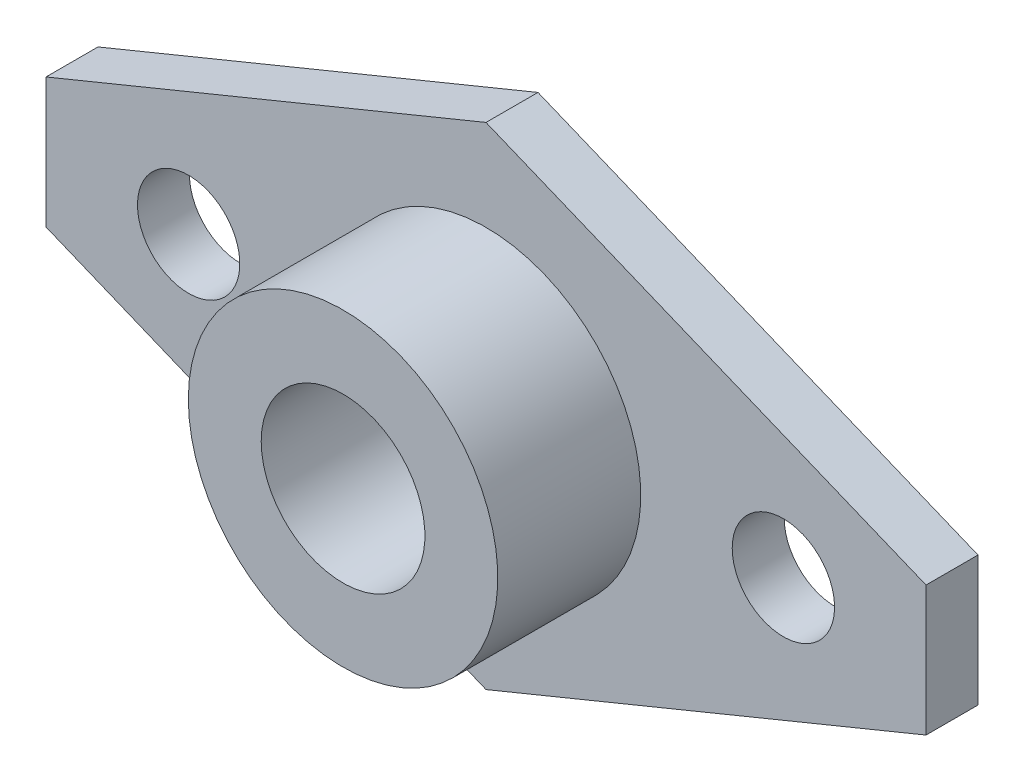
ISO-10303-21;
HEADER;
FILE_DESCRIPTION(('STEP AP214'),'2;1');
FILE_NAME('part.step','',(''),(''),'','','');
FILE_SCHEMA(('AUTOMOTIVE_DESIGN { 1 0 10303 214 1 1 1 1 }'));
ENDSEC;
DATA;
#1=APPLICATION_CONTEXT('core data for automotive mechanical design processes');
#2=APPLICATION_PROTOCOL_DEFINITION('international standard','automotive_design',2000,#1);
#3=PRODUCT_CONTEXT('',#1,'mechanical');
#4=PRODUCT('Part','Part','',(#3));
#5=PRODUCT_RELATED_PRODUCT_CATEGORY('part','',(#4));
#6=PRODUCT_DEFINITION_FORMATION('','',#4);
#7=PRODUCT_DEFINITION_CONTEXT('part definition',#1,'design');
#8=PRODUCT_DEFINITION('design','',#6,#7);
#9=PRODUCT_DEFINITION_SHAPE('','',#8);
#10=(LENGTH_UNIT() NAMED_UNIT(*) SI_UNIT(.MILLI.,.METRE.));
#11=(NAMED_UNIT(*) PLANE_ANGLE_UNIT() SI_UNIT($,.RADIAN.));
#12=(NAMED_UNIT(*) SI_UNIT($,.STERADIAN.) SOLID_ANGLE_UNIT());
#13=UNCERTAINTY_MEASURE_WITH_UNIT(LENGTH_MEASURE(1.E-05),#10,'distance_accuracy_value','');
#14=(GEOMETRIC_REPRESENTATION_CONTEXT(3) GLOBAL_UNCERTAINTY_ASSIGNED_CONTEXT((#13)) GLOBAL_UNIT_ASSIGNED_CONTEXT((#10,
#11,#12)) REPRESENTATION_CONTEXT('',''));
#15=CARTESIAN_POINT('',(0.,0.,0.));
#16=DIRECTION('',(0.,0.,1.));
#17=DIRECTION('',(1.,0.,0.));
#18=AXIS2_PLACEMENT_3D('',#15,#16,#17);
#19=CARTESIAN_POINT('',(-21.5000000000001,3.17499999999994,2.54));
#20=DIRECTION('',(-0.379721609469789,0.92510080494056,0.));
#21=DIRECTION('',(-0.925100804940561,-0.379721609469789,0.));
#22=AXIS2_PLACEMENT_3D('',#19,#20,#21);
#23=PLANE('',#22);
#24=DIRECTION('',(0.92510080494056,0.379721609469789,0.));
#25=VECTOR('',#24,1.);
#26=CARTESIAN_POINT('',(-21.5000000000001,3.17499999999994,0.));
#27=LINE('',#26,#25);
#28=CARTESIAN_POINT('',(-21.5000000000001,3.17499999999994,0.));
#29=VERTEX_POINT('',#28);
#30=CARTESIAN_POINT('',(-1.38777878078145E-13,12.,0.));
#31=VERTEX_POINT('',#30);
#32=EDGE_CURVE('E120',#29,#31,#27,.T.);
#33=ORIENTED_EDGE('',*,*,#32,.F.);
#34=DIRECTION('',(0.,0.,-1.));
#35=VECTOR('',#34,1.);
#36=CARTESIAN_POINT('',(-21.5000000000001,3.17499999999994,2.54));
#37=LINE('',#36,#35);
#38=CARTESIAN_POINT('',(-21.5000000000001,3.17499999999994,2.54));
#39=VERTEX_POINT('',#38);
#40=EDGE_CURVE('E11',#39,#29,#37,.T.);
#41=ORIENTED_EDGE('',*,*,#40,.F.);
#42=DIRECTION('',(0.92510080494056,0.379721609469789,0.));
#43=VECTOR('',#42,1.);
#44=CARTESIAN_POINT('',(-21.5000000000001,3.17499999999994,2.54));
#45=LINE('',#44,#43);
#46=CARTESIAN_POINT('',(-1.38777878078145E-13,12.,2.54));
#47=VERTEX_POINT('',#46);
#48=EDGE_CURVE('E135',#39,#47,#45,.T.);
#49=ORIENTED_EDGE('',*,*,#48,.T.);
#50=DIRECTION('',(0.,0.,-1.));
#51=VECTOR('',#50,1.);
#52=CARTESIAN_POINT('',(-1.38777878078145E-13,12.,2.54));
#53=LINE('',#52,#51);
#54=EDGE_CURVE('E85',#47,#31,#53,.T.);
#55=ORIENTED_EDGE('',*,*,#54,.T.);
#56=EDGE_LOOP('',(#33,#41,#49,#55));
#57=FACE_BOUND('',#56,.T.);
#58=ADVANCED_FACE('F35',(#57),#23,.T.);
#59=CARTESIAN_POINT('',(-21.5000000000001,-3.17500000000006,2.54));
#60=DIRECTION('',(-1.,0.,0.));
#61=DIRECTION('',(0.,0.,1.));
#62=AXIS2_PLACEMENT_3D('',#59,#60,#61);
#63=PLANE('',#62);
#64=DIRECTION('',(0.,1.,0.));
#65=VECTOR('',#64,1.);
#66=CARTESIAN_POINT('',(-21.5000000000001,-3.17500000000006,0.));
#67=LINE('',#66,#65);
#68=CARTESIAN_POINT('',(-21.5000000000001,-3.17500000000006,0.));
#69=VERTEX_POINT('',#68);
#70=EDGE_CURVE('E133',#69,#29,#67,.T.);
#71=ORIENTED_EDGE('',*,*,#70,.F.);
#72=DIRECTION('',(0.,0.,-1.));
#73=VECTOR('',#72,1.);
#74=CARTESIAN_POINT('',(-21.5000000000001,-3.17500000000006,2.54));
#75=LINE('',#74,#73);
#76=CARTESIAN_POINT('',(-21.5000000000001,-3.17500000000006,2.54));
#77=VERTEX_POINT('',#76);
#78=EDGE_CURVE('E44',#77,#69,#75,.T.);
#79=ORIENTED_EDGE('',*,*,#78,.F.);
#80=DIRECTION('',(0.,1.,0.));
#81=VECTOR('',#80,1.);
#82=CARTESIAN_POINT('',(-21.5000000000001,-3.17500000000006,2.54));
#83=LINE('',#82,#81);
#84=EDGE_CURVE('E109',#77,#39,#83,.T.);
#85=ORIENTED_EDGE('',*,*,#84,.T.);
#86=ORIENTED_EDGE('',*,*,#40,.T.);
#87=EDGE_LOOP('',(#71,#79,#85,#86));
#88=FACE_BOUND('',#87,.T.);
#89=ADVANCED_FACE('F171',(#88),#63,.T.);
#90=CARTESIAN_POINT('',(0.,-12.0000000000001,2.54));
#91=DIRECTION('',(-0.379721609469785,-0.925100804940562,0.));
#92=DIRECTION('',(0.925100804940562,-0.379721609469785,0.));
#93=AXIS2_PLACEMENT_3D('',#90,#91,#92);
#94=PLANE('',#93);
#95=DIRECTION('',(-0.925100804940562,0.379721609469785,0.));
#96=VECTOR('',#95,1.);
#97=CARTESIAN_POINT('',(0.,-12.0000000000001,0.));
#98=LINE('',#97,#96);
#99=CARTESIAN_POINT('',(0.,-12.0000000000001,0.));
#100=VERTEX_POINT('',#99);
#101=EDGE_CURVE('E98',#100,#69,#98,.T.);
#102=ORIENTED_EDGE('',*,*,#101,.F.);
#103=DIRECTION('',(0.,0.,-1.));
#104=VECTOR('',#103,1.);
#105=CARTESIAN_POINT('',(0.,-12.0000000000001,2.54));
#106=LINE('',#105,#104);
#107=CARTESIAN_POINT('',(0.,-12.0000000000001,2.54));
#108=VERTEX_POINT('',#107);
#109=EDGE_CURVE('E93',#108,#100,#106,.T.);
#110=ORIENTED_EDGE('',*,*,#109,.F.);
#111=DIRECTION('',(-0.925100804940562,0.379721609469785,0.));
#112=VECTOR('',#111,1.);
#113=CARTESIAN_POINT('',(0.,-12.0000000000001,2.54));
#114=LINE('',#113,#112);
#115=EDGE_CURVE('E96',#108,#77,#114,.T.);
#116=ORIENTED_EDGE('',*,*,#115,.T.);
#117=ORIENTED_EDGE('',*,*,#78,.T.);
#118=EDGE_LOOP('',(#102,#110,#116,#117));
#119=FACE_BOUND('',#118,.T.);
#120=ADVANCED_FACE('F95',(#119),#94,.T.);
#121=CARTESIAN_POINT('',(21.4999999999999,-3.17500000000013,2.54));
#122=DIRECTION('',(0.379721609469789,-0.92510080494056,0.));
#123=DIRECTION('',(0.925100804940561,0.379721609469789,0.));
#124=AXIS2_PLACEMENT_3D('',#121,#122,#123);
#125=PLANE('',#124);
#126=DIRECTION('',(-0.925100804940561,-0.379721609469789,0.));
#127=VECTOR('',#126,1.);
#128=CARTESIAN_POINT('',(21.4999999999999,-3.17500000000013,0.));
#129=LINE('',#128,#127);
#130=CARTESIAN_POINT('',(21.4999999999999,-3.17500000000013,0.));
#131=VERTEX_POINT('',#130);
#132=EDGE_CURVE('E130',#131,#100,#129,.T.);
#133=ORIENTED_EDGE('',*,*,#132,.F.);
#134=DIRECTION('',(0.,0.,-1.));
#135=VECTOR('',#134,1.);
#136=CARTESIAN_POINT('',(21.4999999999999,-3.17500000000013,2.54));
#137=LINE('',#136,#135);
#138=CARTESIAN_POINT('',(21.4999999999999,-3.17500000000013,2.54));
#139=VERTEX_POINT('',#138);
#140=EDGE_CURVE('E103',#139,#131,#137,.T.);
#141=ORIENTED_EDGE('',*,*,#140,.F.);
#142=DIRECTION('',(-0.925100804940561,-0.379721609469789,0.));
#143=VECTOR('',#142,1.);
#144=CARTESIAN_POINT('',(21.4999999999999,-3.17500000000013,2.54));
#145=LINE('',#144,#143);
#146=EDGE_CURVE('E108',#139,#108,#145,.T.);
#147=ORIENTED_EDGE('',*,*,#146,.T.);
#148=ORIENTED_EDGE('',*,*,#109,.T.);
#149=EDGE_LOOP('',(#133,#141,#147,#148));
#150=FACE_BOUND('',#149,.T.);
#151=ADVANCED_FACE('F112',(#150),#125,.T.);
#152=CARTESIAN_POINT('',(21.4999999999999,0.,2.54));
#153=DIRECTION('',(1.,0.,0.));
#154=DIRECTION('',(0.,1.,0.));
#155=AXIS2_PLACEMENT_3D('',#152,#153,#154);
#156=PLANE('',#155);
#157=DIRECTION('',(0.,-1.,0.));
#158=VECTOR('',#157,1.);
#159=CARTESIAN_POINT('',(21.4999999999999,0.,0.));
#160=LINE('',#159,#158);
#161=CARTESIAN_POINT('',(21.4999999999999,3.17500000000004,0.));
#162=VERTEX_POINT('',#161);
#163=EDGE_CURVE('E127',#162,#131,#160,.T.);
#164=ORIENTED_EDGE('',*,*,#163,.F.);
#165=DIRECTION('',(0.,0.,-1.));
#166=VECTOR('',#165,1.);
#167=CARTESIAN_POINT('',(21.4999999999999,3.17500000000004,2.54));
#168=LINE('',#167,#166);
#169=CARTESIAN_POINT('',(21.4999999999999,3.17500000000004,2.54));
#170=VERTEX_POINT('',#169);
#171=EDGE_CURVE('E139',#170,#162,#168,.T.);
#172=ORIENTED_EDGE('',*,*,#171,.F.);
#173=DIRECTION('',(0.,1.,0.));
#174=VECTOR('',#173,1.);
#175=CARTESIAN_POINT('',(21.4999999999999,0.,2.54));
#176=LINE('',#175,#174);
#177=EDGE_CURVE('E113',#139,#170,#176,.T.);
#178=ORIENTED_EDGE('',*,*,#177,.F.);
#179=ORIENTED_EDGE('',*,*,#140,.T.);
#180=EDGE_LOOP('',(#164,#172,#178,#179));
#181=FACE_BOUND('',#180,.T.);
#182=ADVANCED_FACE('F184',(#181),#156,.T.);
#183=CARTESIAN_POINT('',(-1.38777878078145E-13,12.,2.54));
#184=DIRECTION('',(0.379721609469785,0.925100804940562,0.));
#185=DIRECTION('',(-0.925100804940562,0.379721609469785,0.));
#186=AXIS2_PLACEMENT_3D('',#183,#184,#185);
#187=PLANE('',#186);
#188=DIRECTION('',(0.925100804940562,-0.379721609469785,0.));
#189=VECTOR('',#188,1.);
#190=CARTESIAN_POINT('',(-1.38777878078145E-13,12.,0.));
#191=LINE('',#190,#189);
#192=EDGE_CURVE('E123',#31,#162,#191,.T.);
#193=ORIENTED_EDGE('',*,*,#192,.F.);
#194=ORIENTED_EDGE('',*,*,#54,.F.);
#195=DIRECTION('',(0.925100804940562,-0.379721609469785,0.));
#196=VECTOR('',#195,1.);
#197=CARTESIAN_POINT('',(-1.38777878078145E-13,12.,2.54));
#198=LINE('',#197,#196);
#199=EDGE_CURVE('E115',#47,#170,#198,.T.);
#200=ORIENTED_EDGE('',*,*,#199,.T.);
#201=ORIENTED_EDGE('',*,*,#171,.T.);
#202=EDGE_LOOP('',(#193,#194,#200,#201));
#203=FACE_BOUND('',#202,.T.);
#204=ADVANCED_FACE('F167',(#203),#187,.T.);
#205=CARTESIAN_POINT('',(0.,0.,2.54));
#206=DIRECTION('',(0.,0.,1.));
#207=DIRECTION('',(1.,0.,0.));
#208=AXIS2_PLACEMENT_3D('',#205,#206,#207);
#209=PLANE('',#208);
#210=CARTESIAN_POINT('',(-14.5303773647368,0.,2.54));
#211=DIRECTION('',(0.,0.,1.));
#212=DIRECTION('',(1.,0.,0.));
#213=AXIS2_PLACEMENT_3D('',#210,#211,#212);
#214=CIRCLE('',#213,2.5);
#215=CARTESIAN_POINT('',(-17.0303773647368,0.,2.54));
#216=VERTEX_POINT('',#215);
#217=EDGE_CURVE('E145',#216,#216,#214,.F.);
#218=ORIENTED_EDGE('',*,*,#217,.T.);
#219=EDGE_LOOP('',(#218));
#220=FACE_BOUND('',#219,.T.);
#221=CARTESIAN_POINT('',(14.5303773647365,0.,2.54));
#222=DIRECTION('',(0.,0.,1.));
#223=DIRECTION('',(1.,0.,0.));
#224=AXIS2_PLACEMENT_3D('',#221,#222,#223);
#225=CIRCLE('',#224,2.5);
#226=CARTESIAN_POINT('',(12.0303773647365,0.,2.54));
#227=VERTEX_POINT('',#226);
#228=EDGE_CURVE('E144',#227,#227,#225,.F.);
#229=ORIENTED_EDGE('',*,*,#228,.T.);
#230=EDGE_LOOP('',(#229));
#231=FACE_BOUND('',#230,.T.);
#232=CARTESIAN_POINT('',(-1.42247325030098E-13,0.,2.54));
#233=DIRECTION('',(0.,0.,1.));
#234=DIRECTION('',(1.,0.,0.));
#235=AXIS2_PLACEMENT_3D('',#232,#233,#234);
#236=CIRCLE('',#235,7.56075472947334);
#237=CARTESIAN_POINT('',(-7.56075472947349,0.,2.54));
#238=VERTEX_POINT('',#237);
#239=EDGE_CURVE('E124',#238,#238,#236,.F.);
#240=ORIENTED_EDGE('',*,*,#239,.T.);
#241=EDGE_LOOP('',(#240));
#242=FACE_BOUND('',#241,.T.);
#243=ORIENTED_EDGE('',*,*,#48,.F.);
#244=ORIENTED_EDGE('',*,*,#84,.F.);
#245=ORIENTED_EDGE('',*,*,#115,.F.);
#246=ORIENTED_EDGE('',*,*,#146,.F.);
#247=ORIENTED_EDGE('',*,*,#177,.T.);
#248=ORIENTED_EDGE('',*,*,#199,.F.);
#249=EDGE_LOOP('',(#243,#244,#245,#246,#247,#248));
#250=FACE_BOUND('',#249,.T.);
#251=ADVANCED_FACE('F107',(#220,#231,#242,#250),#209,.T.);
#252=CARTESIAN_POINT('',(0.,0.,0.));
#253=DIRECTION('',(0.,0.,1.));
#254=DIRECTION('',(1.,0.,0.));
#255=AXIS2_PLACEMENT_3D('',#252,#253,#254);
#256=PLANE('',#255);
#257=CARTESIAN_POINT('',(-14.5303773647368,0.,0.));
#258=DIRECTION('',(0.,0.,1.));
#259=DIRECTION('',(1.,0.,0.));
#260=AXIS2_PLACEMENT_3D('',#257,#258,#259);
#261=CIRCLE('',#260,2.5);
#262=CARTESIAN_POINT('',(-17.0303773647368,0.,0.));
#263=VERTEX_POINT('',#262);
#264=EDGE_CURVE('E38',#263,#263,#261,.F.);
#265=ORIENTED_EDGE('',*,*,#264,.F.);
#266=EDGE_LOOP('',(#265));
#267=FACE_BOUND('',#266,.T.);
#268=CARTESIAN_POINT('',(14.5303773647365,0.,0.));
#269=DIRECTION('',(0.,0.,1.));
#270=DIRECTION('',(1.,0.,0.));
#271=AXIS2_PLACEMENT_3D('',#268,#269,#270);
#272=CIRCLE('',#271,2.5);
#273=CARTESIAN_POINT('',(12.0303773647365,0.,0.));
#274=VERTEX_POINT('',#273);
#275=EDGE_CURVE('E142',#274,#274,#272,.F.);
#276=ORIENTED_EDGE('',*,*,#275,.F.);
#277=EDGE_LOOP('',(#276));
#278=FACE_BOUND('',#277,.T.);
#279=CARTESIAN_POINT('',(-1.42247325030098E-13,0.,0.));
#280=DIRECTION('',(0.,0.,1.));
#281=DIRECTION('',(1.,0.,0.));
#282=AXIS2_PLACEMENT_3D('',#279,#280,#281);
#283=CIRCLE('',#282,4.);
#284=CARTESIAN_POINT('',(-4.00000000000014,0.,0.));
#285=VERTEX_POINT('',#284);
#286=EDGE_CURVE('E159',#285,#285,#283,.F.);
#287=ORIENTED_EDGE('',*,*,#286,.F.);
#288=EDGE_LOOP('',(#287));
#289=FACE_BOUND('',#288,.T.);
#290=ORIENTED_EDGE('',*,*,#32,.T.);
#291=ORIENTED_EDGE('',*,*,#192,.T.);
#292=ORIENTED_EDGE('',*,*,#163,.T.);
#293=ORIENTED_EDGE('',*,*,#132,.T.);
#294=ORIENTED_EDGE('',*,*,#101,.T.);
#295=ORIENTED_EDGE('',*,*,#70,.T.);
#296=EDGE_LOOP('',(#290,#291,#292,#293,#294,#295));
#297=FACE_BOUND('',#296,.T.);
#298=ADVANCED_FACE('F170',(#267,#278,#289,#297),#256,.F.);
#299=CARTESIAN_POINT('',(-1.42247325030098E-13,0.,9.525));
#300=DIRECTION('',(0.,0.,-1.));
#301=DIRECTION('',(-1.,0.,0.));
#302=AXIS2_PLACEMENT_3D('',#299,#300,#301);
#303=CYLINDRICAL_SURFACE('',#302,7.56075472947334);
#304=CARTESIAN_POINT('',(-1.42247325030098E-13,0.,9.525));
#305=DIRECTION('',(0.,0.,1.));
#306=DIRECTION('',(1.,0.,0.));
#307=AXIS2_PLACEMENT_3D('',#304,#305,#306);
#308=CIRCLE('',#307,7.56075472947334);
#309=CARTESIAN_POINT('',(-7.56075472947349,0.,9.525));
#310=VERTEX_POINT('',#309);
#311=EDGE_CURVE('E162',#310,#310,#308,.T.);
#312=CARTESIAN_POINT('',(-7.56075472947349,0.,2.54));
#313=CARTESIAN_POINT('',(-7.56075472947349,0.,2.61276041666667));
#314=CARTESIAN_POINT('',(-7.56075472947349,0.,2.68552083333333));
#315=CARTESIAN_POINT('',(-7.56075472947349,0.,2.83104166666667));
#316=CARTESIAN_POINT('',(-7.56075472947349,0.,2.90380208333333));
#317=CARTESIAN_POINT('',(-7.56075472947349,0.,3.04932291666667));
#318=CARTESIAN_POINT('',(-7.56075472947349,0.,3.12208333333333));
#319=CARTESIAN_POINT('',(-7.56075472947349,0.,3.26760416666667));
#320=CARTESIAN_POINT('',(-7.56075472947349,0.,3.34036458333333));
#321=CARTESIAN_POINT('',(-7.56075472947349,0.,3.48588541666667));
#322=CARTESIAN_POINT('',(-7.56075472947349,0.,3.55864583333333));
#323=CARTESIAN_POINT('',(-7.56075472947349,0.,3.70416666666667));
#324=CARTESIAN_POINT('',(-7.56075472947349,0.,3.77692708333333));
#325=CARTESIAN_POINT('',(-7.56075472947349,0.,3.92244791666667));
#326=CARTESIAN_POINT('',(-7.56075472947349,0.,3.99520833333333));
#327=CARTESIAN_POINT('',(-7.56075472947349,0.,4.14072916666667));
#328=CARTESIAN_POINT('',(-7.56075472947349,0.,4.21348958333333));
#329=CARTESIAN_POINT('',(-7.56075472947349,0.,4.35901041666667));
#330=CARTESIAN_POINT('',(-7.56075472947349,0.,4.43177083333333));
#331=CARTESIAN_POINT('',(-7.56075472947349,0.,4.57729166666667));
#332=CARTESIAN_POINT('',(-7.56075472947349,0.,4.65005208333333));
#333=CARTESIAN_POINT('',(-7.56075472947349,0.,4.79557291666667));
#334=CARTESIAN_POINT('',(-7.56075472947349,0.,4.86833333333333));
#335=CARTESIAN_POINT('',(-7.56075472947349,0.,5.01385416666667));
#336=CARTESIAN_POINT('',(-7.56075472947349,0.,5.08661458333333));
#337=CARTESIAN_POINT('',(-7.56075472947349,0.,5.23213541666667));
#338=CARTESIAN_POINT('',(-7.56075472947349,0.,5.30489583333333));
#339=CARTESIAN_POINT('',(-7.56075472947349,0.,5.45041666666667));
#340=CARTESIAN_POINT('',(-7.56075472947349,0.,5.52317708333333));
#341=CARTESIAN_POINT('',(-7.56075472947349,0.,5.66869791666667));
#342=CARTESIAN_POINT('',(-7.56075472947349,0.,5.74145833333333));
#343=CARTESIAN_POINT('',(-7.56075472947349,0.,5.88697916666667));
#344=CARTESIAN_POINT('',(-7.56075472947349,0.,5.95973958333333));
#345=CARTESIAN_POINT('',(-7.56075472947349,0.,6.10526041666667));
#346=CARTESIAN_POINT('',(-7.56075472947349,0.,6.17802083333333));
#347=CARTESIAN_POINT('',(-7.56075472947349,0.,6.32354166666667));
#348=CARTESIAN_POINT('',(-7.56075472947349,0.,6.39630208333333));
#349=CARTESIAN_POINT('',(-7.56075472947349,0.,6.54182291666667));
#350=CARTESIAN_POINT('',(-7.56075472947349,0.,6.61458333333333));
#351=CARTESIAN_POINT('',(-7.56075472947349,0.,6.76010416666667));
#352=CARTESIAN_POINT('',(-7.56075472947349,0.,6.83286458333333));
#353=CARTESIAN_POINT('',(-7.56075472947349,0.,6.97838541666667));
#354=CARTESIAN_POINT('',(-7.56075472947349,0.,7.05114583333333));
#355=CARTESIAN_POINT('',(-7.56075472947349,0.,7.19666666666667));
#356=CARTESIAN_POINT('',(-7.56075472947349,0.,7.26942708333333));
#357=CARTESIAN_POINT('',(-7.56075472947349,0.,7.41494791666667));
#358=CARTESIAN_POINT('',(-7.56075472947349,0.,7.48770833333333));
#359=CARTESIAN_POINT('',(-7.56075472947349,0.,7.63322916666667));
#360=CARTESIAN_POINT('',(-7.56075472947349,0.,7.70598958333333));
#361=CARTESIAN_POINT('',(-7.56075472947349,0.,7.85151041666667));
#362=CARTESIAN_POINT('',(-7.56075472947349,0.,7.92427083333333));
#363=CARTESIAN_POINT('',(-7.56075472947349,0.,8.06979166666667));
#364=CARTESIAN_POINT('',(-7.56075472947349,0.,8.14255208333333));
#365=CARTESIAN_POINT('',(-7.56075472947349,0.,8.28807291666667));
#366=CARTESIAN_POINT('',(-7.56075472947349,0.,8.36083333333333));
#367=CARTESIAN_POINT('',(-7.56075472947349,0.,8.50635416666667));
#368=CARTESIAN_POINT('',(-7.56075472947349,0.,8.57911458333333));
#369=CARTESIAN_POINT('',(-7.56075472947349,0.,8.72463541666667));
#370=CARTESIAN_POINT('',(-7.56075472947349,0.,8.79739583333333));
#371=CARTESIAN_POINT('',(-7.56075472947349,0.,8.94291666666667));
#372=CARTESIAN_POINT('',(-7.56075472947349,0.,9.01567708333333));
#373=CARTESIAN_POINT('',(-7.56075472947349,0.,9.16119791666667));
#374=CARTESIAN_POINT('',(-7.56075472947349,0.,9.23395833333333));
#375=CARTESIAN_POINT('',(-7.56075472947349,0.,9.37947916666667));
#376=CARTESIAN_POINT('',(-7.56075472947349,0.,9.45223958333333));
#377=CARTESIAN_POINT('',(-7.56075472947349,0.,9.525));
#378=B_SPLINE_CURVE_WITH_KNOTS('',3,(#312,#313,#314,#315,#316,#317,#318,#319,#320,#321,#322,
#323,#324,#325,#326,#327,#328,#329,#330,#331,#332,#333,#334,#335,#336,#337,#338,#339,#340,#341,
#342,#343,#344,#345,#346,#347,#348,#349,#350,#351,#352,#353,#354,#355,#356,#357,#358,#359,#360,
#361,#362,#363,#364,#365,#366,#367,#368,#369,#370,#371,#372,#373,#374,#375,#376,#377),
.UNSPECIFIED.,.F.,.F.,(4,2,2,2,2,2,2,2,2,2,2,2,2,2,2,2,2,2,2,2,2,2,2,2,2,2,2,2,2,2,2,2,4),(0.,
0.21828125,0.4365625,0.65484375,0.873125,1.09140625,1.3096875,1.52796875,1.74625,1.96453125,
2.1828125,2.40109375,2.619375,2.83765625,3.0559375,3.27421875,3.4925,3.71078125,3.9290625,
4.14734375,4.365625,4.58390625,4.8021875,5.02046875,5.23875,5.45703125,5.6753125,5.89359375,
6.111875,6.33015625,6.5484375,6.76671875,6.985),.UNSPECIFIED.);
#379=EDGE_CURVE('BSEAM194',#238,#310,#378,.T.);
#380=ORIENTED_EDGE('',*,*,#239,.F.);
#381=ORIENTED_EDGE('',*,*,#311,.F.);
#382=ORIENTED_EDGE('',*,*,#379,.T.);
#383=ORIENTED_EDGE('',*,*,#379,.F.);
#384=EDGE_LOOP('',(#380,#382,#381,#383));
#385=FACE_BOUND('',#384,.T.);
#386=ADVANCED_FACE('F194',(#385),#303,.T.);
#387=CARTESIAN_POINT('',(-1.42247325030098E-13,0.,9.525));
#388=DIRECTION('',(0.,0.,1.));
#389=DIRECTION('',(1.,0.,0.));
#390=AXIS2_PLACEMENT_3D('',#387,#388,#389);
#391=PLANE('',#390);
#392=CARTESIAN_POINT('',(-1.42247325030098E-13,0.,9.525));
#393=DIRECTION('',(0.,0.,1.));
#394=DIRECTION('',(1.,0.,0.));
#395=AXIS2_PLACEMENT_3D('',#392,#393,#394);
#396=CIRCLE('',#395,4.);
#397=CARTESIAN_POINT('',(-4.00000000000014,0.,9.525));
#398=VERTEX_POINT('',#397);
#399=EDGE_CURVE('E149',#398,#398,#396,.T.);
#400=ORIENTED_EDGE('',*,*,#399,.F.);
#401=EDGE_LOOP('',(#400));
#402=FACE_BOUND('',#401,.T.);
#403=ORIENTED_EDGE('',*,*,#311,.T.);
#404=EDGE_LOOP('',(#403));
#405=FACE_BOUND('',#404,.T.);
#406=ADVANCED_FACE('F200',(#402,#405),#391,.T.);
#407=CARTESIAN_POINT('',(-1.42247325030098E-13,0.,9.525));
#408=DIRECTION('',(0.,0.,-1.));
#409=DIRECTION('',(-1.,0.,0.));
#410=AXIS2_PLACEMENT_3D('',#407,#408,#409);
#411=CYLINDRICAL_SURFACE('',#410,4.);
#412=CARTESIAN_POINT('',(-4.00000000000014,0.,9.525));
#413=CARTESIAN_POINT('',(-4.00000000000014,0.,9.42578125));
#414=CARTESIAN_POINT('',(-4.00000000000014,0.,9.3265625));
#415=CARTESIAN_POINT('',(-4.00000000000014,0.,9.128125));
#416=CARTESIAN_POINT('',(-4.00000000000014,0.,9.02890625));
#417=CARTESIAN_POINT('',(-4.00000000000014,0.,8.83046875));
#418=CARTESIAN_POINT('',(-4.00000000000014,0.,8.73125));
#419=CARTESIAN_POINT('',(-4.00000000000014,0.,8.5328125));
#420=CARTESIAN_POINT('',(-4.00000000000014,0.,8.43359375));
#421=CARTESIAN_POINT('',(-4.00000000000014,0.,8.23515625));
#422=CARTESIAN_POINT('',(-4.00000000000014,0.,8.1359375));
#423=CARTESIAN_POINT('',(-4.00000000000014,0.,7.9375));
#424=CARTESIAN_POINT('',(-4.00000000000014,0.,7.83828125));
#425=CARTESIAN_POINT('',(-4.00000000000014,0.,7.63984375));
#426=CARTESIAN_POINT('',(-4.00000000000014,0.,7.540625));
#427=CARTESIAN_POINT('',(-4.00000000000014,0.,7.3421875));
#428=CARTESIAN_POINT('',(-4.00000000000014,0.,7.24296875));
#429=CARTESIAN_POINT('',(-4.00000000000014,0.,7.04453125));
#430=CARTESIAN_POINT('',(-4.00000000000014,0.,6.9453125));
#431=CARTESIAN_POINT('',(-4.00000000000014,0.,6.746875));
#432=CARTESIAN_POINT('',(-4.00000000000014,0.,6.64765625));
#433=CARTESIAN_POINT('',(-4.00000000000014,0.,6.44921875));
#434=CARTESIAN_POINT('',(-4.00000000000014,0.,6.35));
#435=CARTESIAN_POINT('',(-4.00000000000014,0.,6.1515625));
#436=CARTESIAN_POINT('',(-4.00000000000014,0.,6.05234375));
#437=CARTESIAN_POINT('',(-4.00000000000014,0.,5.85390625));
#438=CARTESIAN_POINT('',(-4.00000000000014,0.,5.7546875));
#439=CARTESIAN_POINT('',(-4.00000000000014,0.,5.55625));
#440=CARTESIAN_POINT('',(-4.00000000000014,0.,5.45703125));
#441=CARTESIAN_POINT('',(-4.00000000000014,0.,5.25859375));
#442=CARTESIAN_POINT('',(-4.00000000000014,0.,5.159375));
#443=CARTESIAN_POINT('',(-4.00000000000014,0.,4.9609375));
#444=CARTESIAN_POINT('',(-4.00000000000014,0.,4.86171875));
#445=CARTESIAN_POINT('',(-4.00000000000014,0.,4.66328125));
#446=CARTESIAN_POINT('',(-4.00000000000014,0.,4.5640625));
#447=CARTESIAN_POINT('',(-4.00000000000014,0.,4.365625));
#448=CARTESIAN_POINT('',(-4.00000000000014,0.,4.26640625));
#449=CARTESIAN_POINT('',(-4.00000000000014,0.,4.06796875));
#450=CARTESIAN_POINT('',(-4.00000000000014,0.,3.96875));
#451=CARTESIAN_POINT('',(-4.00000000000014,0.,3.7703125));
#452=CARTESIAN_POINT('',(-4.00000000000014,0.,3.67109375));
#453=CARTESIAN_POINT('',(-4.00000000000014,0.,3.47265625));
#454=CARTESIAN_POINT('',(-4.00000000000014,0.,3.3734375));
#455=CARTESIAN_POINT('',(-4.00000000000014,0.,3.175));
#456=CARTESIAN_POINT('',(-4.00000000000014,0.,3.07578125));
#457=CARTESIAN_POINT('',(-4.00000000000014,0.,2.87734375));
#458=CARTESIAN_POINT('',(-4.00000000000014,0.,2.778125));
#459=CARTESIAN_POINT('',(-4.00000000000014,0.,2.5796875));
#460=CARTESIAN_POINT('',(-4.00000000000014,0.,2.48046875));
#461=CARTESIAN_POINT('',(-4.00000000000014,0.,2.28203125));
#462=CARTESIAN_POINT('',(-4.00000000000014,0.,2.1828125));
#463=CARTESIAN_POINT('',(-4.00000000000014,0.,1.984375));
#464=CARTESIAN_POINT('',(-4.00000000000014,0.,1.88515625));
#465=CARTESIAN_POINT('',(-4.00000000000014,0.,1.68671875));
#466=CARTESIAN_POINT('',(-4.00000000000014,0.,1.5875));
#467=CARTESIAN_POINT('',(-4.00000000000014,0.,1.3890625));
#468=CARTESIAN_POINT('',(-4.00000000000014,0.,1.28984375));
#469=CARTESIAN_POINT('',(-4.00000000000014,0.,1.09140625));
#470=CARTESIAN_POINT('',(-4.00000000000014,0.,0.992187500000001));
#471=CARTESIAN_POINT('',(-4.00000000000014,0.,0.793750000000001));
#472=CARTESIAN_POINT('',(-4.00000000000014,0.,0.69453125));
#473=CARTESIAN_POINT('',(-4.00000000000014,0.,0.49609375));
#474=CARTESIAN_POINT('',(-4.00000000000014,0.,0.396875));
#475=CARTESIAN_POINT('',(-4.00000000000014,0.,0.1984375));
#476=CARTESIAN_POINT('',(-4.00000000000014,0.,0.0992187500000001));
#477=CARTESIAN_POINT('',(-4.00000000000014,0.,0.));
#478=B_SPLINE_CURVE_WITH_KNOTS('',3,(#412,#413,#414,#415,#416,#417,#418,#419,#420,#421,#422,
#423,#424,#425,#426,#427,#428,#429,#430,#431,#432,#433,#434,#435,#436,#437,#438,#439,#440,#441,
#442,#443,#444,#445,#446,#447,#448,#449,#450,#451,#452,#453,#454,#455,#456,#457,#458,#459,#460,
#461,#462,#463,#464,#465,#466,#467,#468,#469,#470,#471,#472,#473,#474,#475,#476,#477),
.UNSPECIFIED.,.F.,.F.,(4,2,2,2,2,2,2,2,2,2,2,2,2,2,2,2,2,2,2,2,2,2,2,2,2,2,2,2,2,2,2,2,4),(0.,
0.297656249999998,0.595312499999999,0.892968749999999,1.190625,1.48828125,1.7859375,2.08359375,
2.38125,2.67890625,2.9765625,3.27421875,3.571875,3.86953125,4.1671875,4.46484375,4.7625,
5.06015625,5.3578125,5.65546875,5.953125,6.25078125,6.5484375,6.84609375,7.14375,7.44140625,
7.7390625,8.03671875,8.334375,8.63203125,8.9296875,9.22734375,9.525),.UNSPECIFIED.);
#479=EDGE_CURVE('BSEAM204',#398,#285,#478,.T.);
#480=ORIENTED_EDGE('',*,*,#399,.T.);
#481=ORIENTED_EDGE('',*,*,#286,.T.);
#482=ORIENTED_EDGE('',*,*,#479,.T.);
#483=ORIENTED_EDGE('',*,*,#479,.F.);
#484=EDGE_LOOP('',(#480,#482,#481,#483));
#485=FACE_BOUND('',#484,.T.);
#486=ADVANCED_FACE('F204',(#485),#411,.F.);
#487=CARTESIAN_POINT('',(14.5303773647365,0.,9.525));
#488=DIRECTION('',(0.,0.,-1.));
#489=DIRECTION('',(-1.,0.,0.));
#490=AXIS2_PLACEMENT_3D('',#487,#488,#489);
#491=CYLINDRICAL_SURFACE('',#490,2.5);
#492=CARTESIAN_POINT('',(12.0303773647365,0.,2.54));
#493=CARTESIAN_POINT('',(12.0303773647365,0.,2.51354166666667));
#494=CARTESIAN_POINT('',(12.0303773647365,0.,2.48708333333333));
#495=CARTESIAN_POINT('',(12.0303773647365,0.,2.43416666666667));
#496=CARTESIAN_POINT('',(12.0303773647365,0.,2.40770833333333));
#497=CARTESIAN_POINT('',(12.0303773647365,0.,2.35479166666667));
#498=CARTESIAN_POINT('',(12.0303773647365,0.,2.32833333333333));
#499=CARTESIAN_POINT('',(12.0303773647365,0.,2.27541666666667));
#500=CARTESIAN_POINT('',(12.0303773647365,0.,2.24895833333333));
#501=CARTESIAN_POINT('',(12.0303773647365,0.,2.19604166666667));
#502=CARTESIAN_POINT('',(12.0303773647365,0.,2.16958333333333));
#503=CARTESIAN_POINT('',(12.0303773647365,0.,2.11666666666667));
#504=CARTESIAN_POINT('',(12.0303773647365,0.,2.09020833333333));
#505=CARTESIAN_POINT('',(12.0303773647365,0.,2.03729166666667));
#506=CARTESIAN_POINT('',(12.0303773647365,0.,2.01083333333333));
#507=CARTESIAN_POINT('',(12.0303773647365,0.,1.95791666666667));
#508=CARTESIAN_POINT('',(12.0303773647365,0.,1.93145833333333));
#509=CARTESIAN_POINT('',(12.0303773647365,0.,1.87854166666667));
#510=CARTESIAN_POINT('',(12.0303773647365,0.,1.85208333333333));
#511=CARTESIAN_POINT('',(12.0303773647365,0.,1.79916666666667));
#512=CARTESIAN_POINT('',(12.0303773647365,0.,1.77270833333333));
#513=CARTESIAN_POINT('',(12.0303773647365,0.,1.71979166666667));
#514=CARTESIAN_POINT('',(12.0303773647365,0.,1.69333333333333));
#515=CARTESIAN_POINT('',(12.0303773647365,0.,1.64041666666667));
#516=CARTESIAN_POINT('',(12.0303773647365,0.,1.61395833333333));
#517=CARTESIAN_POINT('',(12.0303773647365,0.,1.56104166666667));
#518=CARTESIAN_POINT('',(12.0303773647365,0.,1.53458333333333));
#519=CARTESIAN_POINT('',(12.0303773647365,0.,1.48166666666667));
#520=CARTESIAN_POINT('',(12.0303773647365,0.,1.45520833333333));
#521=CARTESIAN_POINT('',(12.0303773647365,0.,1.40229166666667));
#522=CARTESIAN_POINT('',(12.0303773647365,0.,1.37583333333333));
#523=CARTESIAN_POINT('',(12.0303773647365,0.,1.32291666666667));
#524=CARTESIAN_POINT('',(12.0303773647365,0.,1.29645833333333));
#525=CARTESIAN_POINT('',(12.0303773647365,0.,1.24354166666667));
#526=CARTESIAN_POINT('',(12.0303773647365,0.,1.21708333333333));
#527=CARTESIAN_POINT('',(12.0303773647365,0.,1.16416666666667));
#528=CARTESIAN_POINT('',(12.0303773647365,0.,1.13770833333333));
#529=CARTESIAN_POINT('',(12.0303773647365,0.,1.08479166666667));
#530=CARTESIAN_POINT('',(12.0303773647365,0.,1.05833333333333));
#531=CARTESIAN_POINT('',(12.0303773647365,0.,1.00541666666667));
#532=CARTESIAN_POINT('',(12.0303773647365,0.,0.978958333333333));
#533=CARTESIAN_POINT('',(12.0303773647365,0.,0.926041666666667));
#534=CARTESIAN_POINT('',(12.0303773647365,0.,0.899583333333334));
#535=CARTESIAN_POINT('',(12.0303773647365,0.,0.846666666666667));
#536=CARTESIAN_POINT('',(12.0303773647365,0.,0.820208333333333));
#537=CARTESIAN_POINT('',(12.0303773647365,0.,0.767291666666666));
#538=CARTESIAN_POINT('',(12.0303773647365,0.,0.740833333333333));
#539=CARTESIAN_POINT('',(12.0303773647365,0.,0.687916666666667));
#540=CARTESIAN_POINT('',(12.0303773647365,0.,0.661458333333333));
#541=CARTESIAN_POINT('',(12.0303773647365,0.,0.608541666666667));
#542=CARTESIAN_POINT('',(12.0303773647365,0.,0.582083333333334));
#543=CARTESIAN_POINT('',(12.0303773647365,0.,0.529166666666667));
#544=CARTESIAN_POINT('',(12.0303773647365,0.,0.502708333333334));
#545=CARTESIAN_POINT('',(12.0303773647365,0.,0.449791666666667));
#546=CARTESIAN_POINT('',(12.0303773647365,0.,0.423333333333333));
#547=CARTESIAN_POINT('',(12.0303773647365,0.,0.370416666666666));
#548=CARTESIAN_POINT('',(12.0303773647365,0.,0.343958333333333));
#549=CARTESIAN_POINT('',(12.0303773647365,0.,0.291041666666667));
#550=CARTESIAN_POINT('',(12.0303773647365,0.,0.264583333333334));
#551=CARTESIAN_POINT('',(12.0303773647365,0.,0.211666666666667));
#552=CARTESIAN_POINT('',(12.0303773647365,0.,0.185208333333333));
#553=CARTESIAN_POINT('',(12.0303773647365,0.,0.132291666666666));
#554=CARTESIAN_POINT('',(12.0303773647365,0.,0.105833333333333));
#555=CARTESIAN_POINT('',(12.0303773647365,0.,0.0529166666666664));
#556=CARTESIAN_POINT('',(12.0303773647365,0.,0.0264583333333332));
#557=CARTESIAN_POINT('',(12.0303773647365,0.,0.));
#558=B_SPLINE_CURVE_WITH_KNOTS('',3,(#492,#493,#494,#495,#496,#497,#498,#499,#500,#501,#502,
#503,#504,#505,#506,#507,#508,#509,#510,#511,#512,#513,#514,#515,#516,#517,#518,#519,#520,#521,
#522,#523,#524,#525,#526,#527,#528,#529,#530,#531,#532,#533,#534,#535,#536,#537,#538,#539,#540,
#541,#542,#543,#544,#545,#546,#547,#548,#549,#550,#551,#552,#553,#554,#555,#556,#557),
.UNSPECIFIED.,.F.,.F.,(4,2,2,2,2,2,2,2,2,2,2,2,2,2,2,2,2,2,2,2,2,2,2,2,2,2,2,2,2,2,2,2,4),(0.,
0.0793749999999996,0.15875,0.238125,0.3175,0.396875,0.47625,0.555625000000001,0.635,0.714375,
0.79375,0.873125,0.952499999999999,1.031875,1.11125,1.190625,1.27,1.349375,1.42875,1.508125,
1.5875,1.666875,1.74625,1.825625,1.905,1.984375,2.06375,2.143125,2.2225,2.301875,2.38125,
2.460625,2.54),.UNSPECIFIED.);
#559=EDGE_CURVE('BSEAM208',#227,#274,#558,.T.);
#560=ORIENTED_EDGE('',*,*,#228,.F.);
#561=ORIENTED_EDGE('',*,*,#275,.T.);
#562=ORIENTED_EDGE('',*,*,#559,.T.);
#563=ORIENTED_EDGE('',*,*,#559,.F.);
#564=EDGE_LOOP('',(#560,#562,#561,#563));
#565=FACE_BOUND('',#564,.T.);
#566=ADVANCED_FACE('F208',(#565),#491,.F.);
#567=CARTESIAN_POINT('',(-14.5303773647368,0.,9.525));
#568=DIRECTION('',(0.,0.,-1.));
#569=DIRECTION('',(-1.,0.,0.));
#570=AXIS2_PLACEMENT_3D('',#567,#568,#569);
#571=CYLINDRICAL_SURFACE('',#570,2.5);
#572=CARTESIAN_POINT('',(-17.0303773647368,0.,2.54));
#573=CARTESIAN_POINT('',(-17.0303773647368,0.,2.51354166666667));
#574=CARTESIAN_POINT('',(-17.0303773647368,0.,2.48708333333333));
#575=CARTESIAN_POINT('',(-17.0303773647368,0.,2.43416666666667));
#576=CARTESIAN_POINT('',(-17.0303773647368,0.,2.40770833333333));
#577=CARTESIAN_POINT('',(-17.0303773647368,0.,2.35479166666667));
#578=CARTESIAN_POINT('',(-17.0303773647368,0.,2.32833333333333));
#579=CARTESIAN_POINT('',(-17.0303773647368,0.,2.27541666666667));
#580=CARTESIAN_POINT('',(-17.0303773647368,0.,2.24895833333333));
#581=CARTESIAN_POINT('',(-17.0303773647368,0.,2.19604166666667));
#582=CARTESIAN_POINT('',(-17.0303773647368,0.,2.16958333333333));
#583=CARTESIAN_POINT('',(-17.0303773647368,0.,2.11666666666667));
#584=CARTESIAN_POINT('',(-17.0303773647368,0.,2.09020833333333));
#585=CARTESIAN_POINT('',(-17.0303773647368,0.,2.03729166666667));
#586=CARTESIAN_POINT('',(-17.0303773647368,0.,2.01083333333333));
#587=CARTESIAN_POINT('',(-17.0303773647368,0.,1.95791666666667));
#588=CARTESIAN_POINT('',(-17.0303773647368,0.,1.93145833333333));
#589=CARTESIAN_POINT('',(-17.0303773647368,0.,1.87854166666667));
#590=CARTESIAN_POINT('',(-17.0303773647368,0.,1.85208333333333));
#591=CARTESIAN_POINT('',(-17.0303773647368,0.,1.79916666666667));
#592=CARTESIAN_POINT('',(-17.0303773647368,0.,1.77270833333333));
#593=CARTESIAN_POINT('',(-17.0303773647368,0.,1.71979166666667));
#594=CARTESIAN_POINT('',(-17.0303773647368,0.,1.69333333333333));
#595=CARTESIAN_POINT('',(-17.0303773647368,0.,1.64041666666667));
#596=CARTESIAN_POINT('',(-17.0303773647368,0.,1.61395833333333));
#597=CARTESIAN_POINT('',(-17.0303773647368,0.,1.56104166666667));
#598=CARTESIAN_POINT('',(-17.0303773647368,0.,1.53458333333333));
#599=CARTESIAN_POINT('',(-17.0303773647368,0.,1.48166666666667));
#600=CARTESIAN_POINT('',(-17.0303773647368,0.,1.45520833333333));
#601=CARTESIAN_POINT('',(-17.0303773647368,0.,1.40229166666667));
#602=CARTESIAN_POINT('',(-17.0303773647368,0.,1.37583333333333));
#603=CARTESIAN_POINT('',(-17.0303773647368,0.,1.32291666666667));
#604=CARTESIAN_POINT('',(-17.0303773647368,0.,1.29645833333333));
#605=CARTESIAN_POINT('',(-17.0303773647368,0.,1.24354166666667));
#606=CARTESIAN_POINT('',(-17.0303773647368,0.,1.21708333333333));
#607=CARTESIAN_POINT('',(-17.0303773647368,0.,1.16416666666667));
#608=CARTESIAN_POINT('',(-17.0303773647368,0.,1.13770833333333));
#609=CARTESIAN_POINT('',(-17.0303773647368,0.,1.08479166666667));
#610=CARTESIAN_POINT('',(-17.0303773647368,0.,1.05833333333333));
#611=CARTESIAN_POINT('',(-17.0303773647368,0.,1.00541666666667));
#612=CARTESIAN_POINT('',(-17.0303773647368,0.,0.978958333333333));
#613=CARTESIAN_POINT('',(-17.0303773647368,0.,0.926041666666667));
#614=CARTESIAN_POINT('',(-17.0303773647368,0.,0.899583333333334));
#615=CARTESIAN_POINT('',(-17.0303773647368,0.,0.846666666666667));
#616=CARTESIAN_POINT('',(-17.0303773647368,0.,0.820208333333333));
#617=CARTESIAN_POINT('',(-17.0303773647368,0.,0.767291666666666));
#618=CARTESIAN_POINT('',(-17.0303773647368,0.,0.740833333333333));
#619=CARTESIAN_POINT('',(-17.0303773647368,0.,0.687916666666667));
#620=CARTESIAN_POINT('',(-17.0303773647368,0.,0.661458333333333));
#621=CARTESIAN_POINT('',(-17.0303773647368,0.,0.608541666666667));
#622=CARTESIAN_POINT('',(-17.0303773647368,0.,0.582083333333334));
#623=CARTESIAN_POINT('',(-17.0303773647368,0.,0.529166666666667));
#624=CARTESIAN_POINT('',(-17.0303773647368,0.,0.502708333333334));
#625=CARTESIAN_POINT('',(-17.0303773647368,0.,0.449791666666667));
#626=CARTESIAN_POINT('',(-17.0303773647368,0.,0.423333333333333));
#627=CARTESIAN_POINT('',(-17.0303773647368,0.,0.370416666666666));
#628=CARTESIAN_POINT('',(-17.0303773647368,0.,0.343958333333333));
#629=CARTESIAN_POINT('',(-17.0303773647368,0.,0.291041666666667));
#630=CARTESIAN_POINT('',(-17.0303773647368,0.,0.264583333333334));
#631=CARTESIAN_POINT('',(-17.0303773647368,0.,0.211666666666667));
#632=CARTESIAN_POINT('',(-17.0303773647368,0.,0.185208333333333));
#633=CARTESIAN_POINT('',(-17.0303773647368,0.,0.132291666666666));
#634=CARTESIAN_POINT('',(-17.0303773647368,0.,0.105833333333333));
#635=CARTESIAN_POINT('',(-17.0303773647368,0.,0.0529166666666664));
#636=CARTESIAN_POINT('',(-17.0303773647368,0.,0.0264583333333332));
#637=CARTESIAN_POINT('',(-17.0303773647368,0.,0.));
#638=B_SPLINE_CURVE_WITH_KNOTS('',3,(#572,#573,#574,#575,#576,#577,#578,#579,#580,#581,#582,
#583,#584,#585,#586,#587,#588,#589,#590,#591,#592,#593,#594,#595,#596,#597,#598,#599,#600,#601,
#602,#603,#604,#605,#606,#607,#608,#609,#610,#611,#612,#613,#614,#615,#616,#617,#618,#619,#620,
#621,#622,#623,#624,#625,#626,#627,#628,#629,#630,#631,#632,#633,#634,#635,#636,#637),
.UNSPECIFIED.,.F.,.F.,(4,2,2,2,2,2,2,2,2,2,2,2,2,2,2,2,2,2,2,2,2,2,2,2,2,2,2,2,2,2,2,2,4),(0.,
0.0793749999999996,0.15875,0.238125,0.3175,0.396875,0.47625,0.555625000000001,0.635,0.714375,
0.79375,0.873125,0.952499999999999,1.031875,1.11125,1.190625,1.27,1.349375,1.42875,1.508125,
1.5875,1.666875,1.74625,1.825625,1.905,1.984375,2.06375,2.143125,2.2225,2.301875,2.38125,
2.460625,2.54),.UNSPECIFIED.);
#639=EDGE_CURVE('BSEAM212',#216,#263,#638,.T.);
#640=ORIENTED_EDGE('',*,*,#217,.F.);
#641=ORIENTED_EDGE('',*,*,#264,.T.);
#642=ORIENTED_EDGE('',*,*,#639,.T.);
#643=ORIENTED_EDGE('',*,*,#639,.F.);
#644=EDGE_LOOP('',(#640,#642,#641,#643));
#645=FACE_BOUND('',#644,.T.);
#646=ADVANCED_FACE('F212',(#645),#571,.F.);
#647=CLOSED_SHELL('',(#58,#89,#120,#151,#182,#204,#251,#298,#386,#406,#486,#566,#646));
#648=MANIFOLD_SOLID_BREP('B2',#647);
#649=ADVANCED_BREP_SHAPE_REPRESENTATION('',(#18,#648),#14);
#650=SHAPE_DEFINITION_REPRESENTATION(#9,#649);
ENDSEC;
END-ISO-10303-21;
